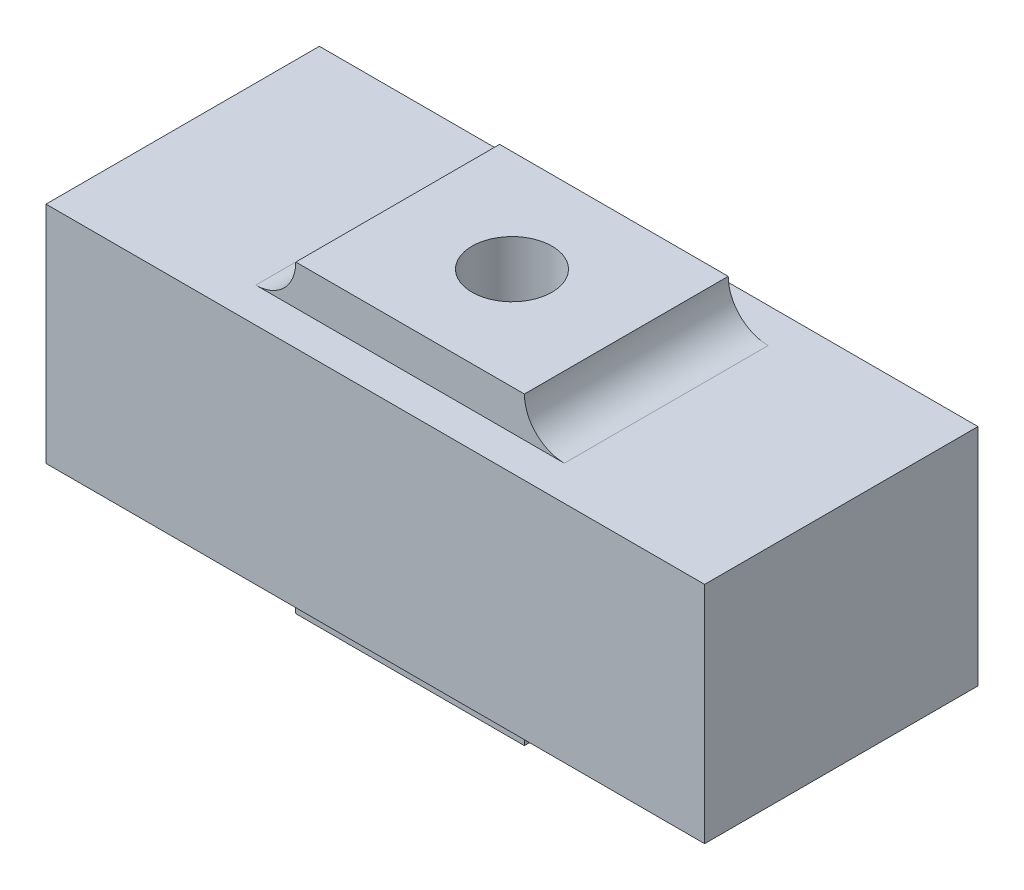
ISO-10303-21;
HEADER;
FILE_DESCRIPTION(('STEP AP214'),'2;1');
FILE_NAME('part.step','',(''),(''),'','','');
FILE_SCHEMA(('AUTOMOTIVE_DESIGN { 1 0 10303 214 1 1 1 1 }'));
ENDSEC;
DATA;
#1=APPLICATION_CONTEXT('core data for automotive mechanical design processes');
#2=APPLICATION_PROTOCOL_DEFINITION('international standard','automotive_design',2000,#1);
#3=PRODUCT_CONTEXT('',#1,'mechanical');
#4=PRODUCT('Part','Part','',(#3));
#5=PRODUCT_RELATED_PRODUCT_CATEGORY('part','',(#4));
#6=PRODUCT_DEFINITION_FORMATION('','',#4);
#7=PRODUCT_DEFINITION_CONTEXT('part definition',#1,'design');
#8=PRODUCT_DEFINITION('design','',#6,#7);
#9=PRODUCT_DEFINITION_SHAPE('','',#8);
#10=(LENGTH_UNIT() NAMED_UNIT(*) SI_UNIT(.MILLI.,.METRE.));
#11=(NAMED_UNIT(*) PLANE_ANGLE_UNIT() SI_UNIT($,.RADIAN.));
#12=(NAMED_UNIT(*) SI_UNIT($,.STERADIAN.) SOLID_ANGLE_UNIT());
#13=UNCERTAINTY_MEASURE_WITH_UNIT(LENGTH_MEASURE(1.E-05),#10,'distance_accuracy_value','');
#14=(GEOMETRIC_REPRESENTATION_CONTEXT(3) GLOBAL_UNCERTAINTY_ASSIGNED_CONTEXT((#13)) GLOBAL_UNIT_ASSIGNED_CONTEXT((#10,
#11,#12)) REPRESENTATION_CONTEXT('',''));
#15=CARTESIAN_POINT('',(0.,0.,0.));
#16=DIRECTION('',(0.,0.,1.));
#17=DIRECTION('',(1.,0.,0.));
#18=AXIS2_PLACEMENT_3D('',#15,#16,#17);
#19=CARTESIAN_POINT('',(20.6,14.05,8.55));
#20=DIRECTION('',(-1.,0.,0.));
#21=DIRECTION('',(0.,0.,1.));
#22=AXIS2_PLACEMENT_3D('',#19,#20,#21);
#23=PLANE('',#22);
#24=DIRECTION('',(0.,0.,-1.));
#25=VECTOR('',#24,1.);
#26=CARTESIAN_POINT('',(20.6,0.,8.55));
#27=LINE('',#26,#25);
#28=CARTESIAN_POINT('',(20.6,0.,8.55));
#29=VERTEX_POINT('',#28);
#30=CARTESIAN_POINT('',(20.6,0.,-8.55));
#31=VERTEX_POINT('',#30);
#32=EDGE_CURVE('E162',#29,#31,#27,.T.);
#33=ORIENTED_EDGE('',*,*,#32,.T.);
#34=DIRECTION('',(0.,-1.,0.));
#35=VECTOR('',#34,1.);
#36=CARTESIAN_POINT('',(20.6,14.05,-8.55));
#37=LINE('',#36,#35);
#38=CARTESIAN_POINT('',(20.6,14.05,-8.55));
#39=VERTEX_POINT('',#38);
#40=EDGE_CURVE('E189',#39,#31,#37,.T.);
#41=ORIENTED_EDGE('',*,*,#40,.F.);
#42=DIRECTION('',(0.,0.,-1.));
#43=VECTOR('',#42,1.);
#44=CARTESIAN_POINT('',(20.6,14.05,8.55));
#45=LINE('',#44,#43);
#46=CARTESIAN_POINT('',(20.6,14.05,8.55));
#47=VERTEX_POINT('',#46);
#48=EDGE_CURVE('E163',#47,#39,#45,.T.);
#49=ORIENTED_EDGE('',*,*,#48,.F.);
#50=DIRECTION('',(0.,-1.,0.));
#51=VECTOR('',#50,1.);
#52=CARTESIAN_POINT('',(20.6,14.05,8.55));
#53=LINE('',#52,#51);
#54=EDGE_CURVE('E173',#47,#29,#53,.T.);
#55=ORIENTED_EDGE('',*,*,#54,.T.);
#56=EDGE_LOOP('',(#33,#41,#49,#55));
#57=FACE_BOUND('',#56,.T.);
#58=ADVANCED_FACE('F34',(#57),#23,.F.);
#59=CARTESIAN_POINT('',(-20.6,14.05,-8.55));
#60=DIRECTION('',(0.,0.,1.));
#61=DIRECTION('',(1.,0.,0.));
#62=AXIS2_PLACEMENT_3D('',#59,#60,#61);
#63=PLANE('',#62);
#64=DIRECTION('',(-1.,0.,0.));
#65=VECTOR('',#64,1.);
#66=CARTESIAN_POINT('',(-20.6,0.,-8.55));
#67=LINE('',#66,#65);
#68=CARTESIAN_POINT('',(-20.6,0.,-8.55));
#69=VERTEX_POINT('',#68);
#70=EDGE_CURVE('E176',#31,#69,#67,.T.);
#71=ORIENTED_EDGE('',*,*,#70,.T.);
#72=DIRECTION('',(0.,-1.,0.));
#73=VECTOR('',#72,1.);
#74=CARTESIAN_POINT('',(-20.6,14.05,-8.55));
#75=LINE('',#74,#73);
#76=CARTESIAN_POINT('',(-20.6,14.05,-8.55));
#77=VERTEX_POINT('',#76);
#78=EDGE_CURVE('E186',#77,#69,#75,.T.);
#79=ORIENTED_EDGE('',*,*,#78,.F.);
#80=DIRECTION('',(-1.,0.,0.));
#81=VECTOR('',#80,1.);
#82=CARTESIAN_POINT('',(-20.6,14.05,-8.55));
#83=LINE('',#82,#81);
#84=EDGE_CURVE('E166',#39,#77,#83,.T.);
#85=ORIENTED_EDGE('',*,*,#84,.F.);
#86=ORIENTED_EDGE('',*,*,#40,.T.);
#87=EDGE_LOOP('',(#71,#79,#85,#86));
#88=FACE_BOUND('',#87,.T.);
#89=ADVANCED_FACE('F254',(#88),#63,.F.);
#90=CARTESIAN_POINT('',(-20.6,14.05,8.55));
#91=DIRECTION('',(1.,0.,0.));
#92=DIRECTION('',(0.,0.,-1.));
#93=AXIS2_PLACEMENT_3D('',#90,#91,#92);
#94=PLANE('',#93);
#95=DIRECTION('',(0.,0.,1.));
#96=VECTOR('',#95,1.);
#97=CARTESIAN_POINT('',(-20.6,0.,8.55));
#98=LINE('',#97,#96);
#99=CARTESIAN_POINT('',(-20.6,0.,8.55));
#100=VERTEX_POINT('',#99);
#101=EDGE_CURVE('E178',#69,#100,#98,.T.);
#102=ORIENTED_EDGE('',*,*,#101,.T.);
#103=DIRECTION('',(0.,-1.,0.));
#104=VECTOR('',#103,1.);
#105=CARTESIAN_POINT('',(-20.6,14.05,8.55));
#106=LINE('',#105,#104);
#107=CARTESIAN_POINT('',(-20.6,14.05,8.55));
#108=VERTEX_POINT('',#107);
#109=EDGE_CURVE('E183',#108,#100,#106,.T.);
#110=ORIENTED_EDGE('',*,*,#109,.F.);
#111=DIRECTION('',(0.,0.,1.));
#112=VECTOR('',#111,1.);
#113=CARTESIAN_POINT('',(-20.6,14.05,8.55));
#114=LINE('',#113,#112);
#115=EDGE_CURVE('E169',#77,#108,#114,.T.);
#116=ORIENTED_EDGE('',*,*,#115,.F.);
#117=ORIENTED_EDGE('',*,*,#78,.T.);
#118=EDGE_LOOP('',(#102,#110,#116,#117));
#119=FACE_BOUND('',#118,.T.);
#120=ADVANCED_FACE('F260',(#119),#94,.F.);
#121=CARTESIAN_POINT('',(-20.6,14.05,8.55));
#122=DIRECTION('',(0.,0.,-1.));
#123=DIRECTION('',(-1.,0.,0.));
#124=AXIS2_PLACEMENT_3D('',#121,#122,#123);
#125=PLANE('',#124);
#126=DIRECTION('',(1.,0.,0.));
#127=VECTOR('',#126,1.);
#128=CARTESIAN_POINT('',(-20.6,0.,8.55));
#129=LINE('',#128,#127);
#130=EDGE_CURVE('E167',#100,#29,#129,.T.);
#131=ORIENTED_EDGE('',*,*,#130,.T.);
#132=ORIENTED_EDGE('',*,*,#54,.F.);
#133=DIRECTION('',(1.,0.,0.));
#134=VECTOR('',#133,1.);
#135=CARTESIAN_POINT('',(-20.6,14.05,8.55));
#136=LINE('',#135,#134);
#137=EDGE_CURVE('E171',#108,#47,#136,.T.);
#138=ORIENTED_EDGE('',*,*,#137,.F.);
#139=ORIENTED_EDGE('',*,*,#109,.T.);
#140=EDGE_LOOP('',(#131,#132,#138,#139));
#141=FACE_BOUND('',#140,.T.);
#142=ADVANCED_FACE('F286',(#141),#125,.F.);
#143=CARTESIAN_POINT('',(0.,14.05,0.));
#144=DIRECTION('',(0.,-1.,0.));
#145=DIRECTION('',(0.,0.,-1.));
#146=AXIS2_PLACEMENT_3D('',#143,#144,#145);
#147=PLANE('',#146);
#148=DIRECTION('',(0.,0.,-1.));
#149=VECTOR('',#148,1.);
#150=CARTESIAN_POINT('',(-9.65,14.05,0.));
#151=LINE('',#150,#149);
#152=CARTESIAN_POINT('',(-9.65,14.05,6.375));
#153=VERTEX_POINT('',#152);
#154=CARTESIAN_POINT('',(-9.65,14.05,-6.375));
#155=VERTEX_POINT('',#154);
#156=EDGE_CURVE('E202',#153,#155,#151,.T.);
#157=ORIENTED_EDGE('',*,*,#156,.T.);
#158=DIRECTION('',(1.,0.,0.));
#159=VECTOR('',#158,1.);
#160=CARTESIAN_POINT('',(0.,14.05,-6.375));
#161=LINE('',#160,#159);
#162=CARTESIAN_POINT('',(9.65,14.05,-6.375));
#163=VERTEX_POINT('',#162);
#164=EDGE_CURVE('E48',#155,#163,#161,.T.);
#165=ORIENTED_EDGE('',*,*,#164,.T.);
#166=DIRECTION('',(0.,0.,1.));
#167=VECTOR('',#166,1.);
#168=CARTESIAN_POINT('',(9.65,14.05,0.));
#169=LINE('',#168,#167);
#170=CARTESIAN_POINT('',(9.65,14.05,6.375));
#171=VERTEX_POINT('',#170);
#172=EDGE_CURVE('E200',#163,#171,#169,.T.);
#173=ORIENTED_EDGE('',*,*,#172,.T.);
#174=DIRECTION('',(-1.,0.,0.));
#175=VECTOR('',#174,1.);
#176=CARTESIAN_POINT('',(0.,14.05,6.375));
#177=LINE('',#176,#175);
#178=EDGE_CURVE('E56',#171,#153,#177,.T.);
#179=ORIENTED_EDGE('',*,*,#178,.T.);
#180=EDGE_LOOP('',(#157,#165,#173,#179));
#181=FACE_BOUND('',#180,.T.);
#182=ORIENTED_EDGE('',*,*,#48,.T.);
#183=ORIENTED_EDGE('',*,*,#84,.T.);
#184=ORIENTED_EDGE('',*,*,#115,.T.);
#185=ORIENTED_EDGE('',*,*,#137,.T.);
#186=EDGE_LOOP('',(#182,#183,#184,#185));
#187=FACE_BOUND('',#186,.T.);
#188=ADVANCED_FACE('F273',(#181,#187),#147,.F.);
#189=CARTESIAN_POINT('',(0.,0.,0.));
#190=DIRECTION('',(0.,-1.,0.));
#191=DIRECTION('',(0.,0.,-1.));
#192=AXIS2_PLACEMENT_3D('',#189,#190,#191);
#193=PLANE('',#192);
#194=DIRECTION('',(-1.,0.,0.));
#195=VECTOR('',#194,1.);
#196=CARTESIAN_POINT('',(0.,0.,6.375));
#197=LINE('',#196,#195);
#198=CARTESIAN_POINT('',(9.65,0.,6.375));
#199=VERTEX_POINT('',#198);
#200=CARTESIAN_POINT('',(-9.65,0.,6.375));
#201=VERTEX_POINT('',#200);
#202=EDGE_CURVE('E192',#199,#201,#197,.T.);
#203=ORIENTED_EDGE('',*,*,#202,.F.);
#204=DIRECTION('',(0.,0.,1.));
#205=VECTOR('',#204,1.);
#206=CARTESIAN_POINT('',(9.65,0.,-6.375));
#207=LINE('',#206,#205);
#208=CARTESIAN_POINT('',(9.65,0.,-6.375));
#209=VERTEX_POINT('',#208);
#210=EDGE_CURVE('E197',#199,#209,#207,.F.);
#211=ORIENTED_EDGE('',*,*,#210,.T.);
#212=DIRECTION('',(1.,0.,0.));
#213=VECTOR('',#212,1.);
#214=CARTESIAN_POINT('',(0.,0.,-6.375));
#215=LINE('',#214,#213);
#216=CARTESIAN_POINT('',(-9.65,0.,-6.375));
#217=VERTEX_POINT('',#216);
#218=EDGE_CURVE('E194',#217,#209,#215,.T.);
#219=ORIENTED_EDGE('',*,*,#218,.F.);
#220=DIRECTION('',(0.,0.,-1.));
#221=VECTOR('',#220,1.);
#222=CARTESIAN_POINT('',(-9.65,0.,6.375));
#223=LINE('',#222,#221);
#224=EDGE_CURVE('E130',#217,#201,#223,.F.);
#225=ORIENTED_EDGE('',*,*,#224,.T.);
#226=EDGE_LOOP('',(#203,#211,#219,#225));
#227=FACE_BOUND('',#226,.T.);
#228=ORIENTED_EDGE('',*,*,#32,.F.);
#229=ORIENTED_EDGE('',*,*,#130,.F.);
#230=ORIENTED_EDGE('',*,*,#101,.F.);
#231=ORIENTED_EDGE('',*,*,#70,.F.);
#232=EDGE_LOOP('',(#228,#229,#230,#231));
#233=FACE_BOUND('',#232,.T.);
#234=ADVANCED_FACE('F283',(#227,#233),#193,.T.);
#235=CARTESIAN_POINT('',(0.,-2.5,0.));
#236=DIRECTION('',(0.,-1.,0.));
#237=DIRECTION('',(0.,0.,-1.));
#238=AXIS2_PLACEMENT_3D('',#235,#236,#237);
#239=PLANE('',#238);
#240=CARTESIAN_POINT('',(0.,-2.5,0.));
#241=DIRECTION('',(0.,1.,0.));
#242=DIRECTION('',(0.,0.,1.));
#243=AXIS2_PLACEMENT_3D('',#240,#241,#242);
#244=CIRCLE('',#243,2.5);
#245=CARTESIAN_POINT('',(0.,-2.5,2.5));
#246=VERTEX_POINT('',#245);
#247=EDGE_CURVE('E227',#246,#246,#244,.T.);
#248=ORIENTED_EDGE('',*,*,#247,.T.);
#249=EDGE_LOOP('',(#248));
#250=FACE_BOUND('',#249,.T.);
#251=DIRECTION('',(0.,0.,-1.));
#252=VECTOR('',#251,1.);
#253=CARTESIAN_POINT('',(7.15,-2.5,6.375));
#254=LINE('',#253,#252);
#255=CARTESIAN_POINT('',(7.15,-2.5,6.375));
#256=VERTEX_POINT('',#255);
#257=CARTESIAN_POINT('',(7.15,-2.5,-6.375));
#258=VERTEX_POINT('',#257);
#259=EDGE_CURVE('E157',#256,#258,#254,.T.);
#260=ORIENTED_EDGE('',*,*,#259,.F.);
#261=DIRECTION('',(1.,0.,0.));
#262=VECTOR('',#261,1.);
#263=CARTESIAN_POINT('',(-7.15,-2.5,6.375));
#264=LINE('',#263,#262);
#265=CARTESIAN_POINT('',(-7.15,-2.5,6.375));
#266=VERTEX_POINT('',#265);
#267=EDGE_CURVE('E144',#266,#256,#264,.T.);
#268=ORIENTED_EDGE('',*,*,#267,.F.);
#269=DIRECTION('',(0.,0.,1.));
#270=VECTOR('',#269,1.);
#271=CARTESIAN_POINT('',(-7.15,-2.5,6.375));
#272=LINE('',#271,#270);
#273=CARTESIAN_POINT('',(-7.15,-2.5,-6.375));
#274=VERTEX_POINT('',#273);
#275=EDGE_CURVE('E128',#274,#266,#272,.T.);
#276=ORIENTED_EDGE('',*,*,#275,.F.);
#277=DIRECTION('',(-1.,0.,0.));
#278=VECTOR('',#277,1.);
#279=CARTESIAN_POINT('',(-7.15,-2.5,-6.375));
#280=LINE('',#279,#278);
#281=EDGE_CURVE('E141',#258,#274,#280,.T.);
#282=ORIENTED_EDGE('',*,*,#281,.F.);
#283=EDGE_LOOP('',(#260,#268,#276,#282));
#284=FACE_BOUND('',#283,.T.);
#285=ADVANCED_FACE('F140',(#250,#284),#239,.T.);
#286=CARTESIAN_POINT('',(-7.15,-24.158614250514,6.375));
#287=DIRECTION('',(0.,0.,1.));
#288=DIRECTION('',(1.,0.,0.));
#289=AXIS2_PLACEMENT_3D('',#286,#287,#288);
#290=PLANE('',#289);
#291=ORIENTED_EDGE('',*,*,#267,.T.);
#292=CARTESIAN_POINT('',(9.65,-2.5,6.375));
#293=DIRECTION('',(0.,0.,1.));
#294=DIRECTION('',(1.,0.,0.));
#295=AXIS2_PLACEMENT_3D('',#292,#293,#294);
#296=CIRCLE('',#295,2.5);
#297=EDGE_CURVE('E204',#256,#199,#296,.F.);
#298=ORIENTED_EDGE('',*,*,#297,.T.);
#299=ORIENTED_EDGE('',*,*,#202,.T.);
#300=CARTESIAN_POINT('',(-9.65,-2.5,6.375));
#301=DIRECTION('',(0.,0.,1.));
#302=DIRECTION('',(1.,0.,0.));
#303=AXIS2_PLACEMENT_3D('',#300,#301,#302);
#304=CIRCLE('',#303,2.5);
#305=EDGE_CURVE('E133',#201,#266,#304,.F.);
#306=ORIENTED_EDGE('',*,*,#305,.T.);
#307=EDGE_LOOP('',(#291,#298,#299,#306));
#308=FACE_BOUND('',#307,.T.);
#309=ADVANCED_FACE('F251',(#308),#290,.T.);
#310=CARTESIAN_POINT('',(-7.15,-24.158614250514,-6.375));
#311=DIRECTION('',(0.,0.,-1.));
#312=DIRECTION('',(-1.,0.,0.));
#313=AXIS2_PLACEMENT_3D('',#310,#311,#312);
#314=PLANE('',#313);
#315=ORIENTED_EDGE('',*,*,#281,.T.);
#316=CARTESIAN_POINT('',(-9.65,-2.5,-6.375));
#317=DIRECTION('',(0.,0.,-1.));
#318=DIRECTION('',(-1.,0.,0.));
#319=AXIS2_PLACEMENT_3D('',#316,#317,#318);
#320=CIRCLE('',#319,2.5);
#321=EDGE_CURVE('E124',#274,#217,#320,.F.);
#322=ORIENTED_EDGE('',*,*,#321,.T.);
#323=ORIENTED_EDGE('',*,*,#218,.T.);
#324=CARTESIAN_POINT('',(9.65,-2.5,-6.375));
#325=DIRECTION('',(0.,0.,-1.));
#326=DIRECTION('',(-1.,0.,0.));
#327=AXIS2_PLACEMENT_3D('',#324,#325,#326);
#328=CIRCLE('',#327,2.5);
#329=EDGE_CURVE('E134',#209,#258,#328,.F.);
#330=ORIENTED_EDGE('',*,*,#329,.T.);
#331=EDGE_LOOP('',(#315,#322,#323,#330));
#332=FACE_BOUND('',#331,.T.);
#333=ADVANCED_FACE('F146',(#332),#314,.T.);
#334=ORIENTED_EDGE('',*,*,#164,.F.);
#335=CARTESIAN_POINT('',(-9.65,16.55,-6.375));
#336=DIRECTION('',(0.,0.,-1.));
#337=DIRECTION('',(-1.,0.,0.));
#338=AXIS2_PLACEMENT_3D('',#335,#336,#337);
#339=CIRCLE('',#338,2.5);
#340=CARTESIAN_POINT('',(-7.15,16.55,-6.375));
#341=VERTEX_POINT('',#340);
#342=EDGE_CURVE('E209',#155,#341,#339,.F.);
#343=ORIENTED_EDGE('',*,*,#342,.T.);
#344=DIRECTION('',(-1.,0.,0.));
#345=VECTOR('',#344,1.);
#346=CARTESIAN_POINT('',(-7.15,16.55,-6.375));
#347=LINE('',#346,#345);
#348=CARTESIAN_POINT('',(7.15,16.55,-6.375));
#349=VERTEX_POINT('',#348);
#350=EDGE_CURVE('E226',#349,#341,#347,.T.);
#351=ORIENTED_EDGE('',*,*,#350,.F.);
#352=CARTESIAN_POINT('',(9.65,16.55,-6.375));
#353=DIRECTION('',(0.,0.,-1.));
#354=DIRECTION('',(-1.,0.,0.));
#355=AXIS2_PLACEMENT_3D('',#352,#353,#354);
#356=CIRCLE('',#355,2.5);
#357=EDGE_CURVE('E12',#349,#163,#356,.F.);
#358=ORIENTED_EDGE('',*,*,#357,.T.);
#359=EDGE_LOOP('',(#334,#343,#351,#358));
#360=FACE_BOUND('',#359,.T.);
#361=ADVANCED_FACE('F249',(#360),#314,.T.);
#362=ORIENTED_EDGE('',*,*,#178,.F.);
#363=CARTESIAN_POINT('',(9.65,16.55,6.375));
#364=DIRECTION('',(0.,0.,1.));
#365=DIRECTION('',(1.,0.,0.));
#366=AXIS2_PLACEMENT_3D('',#363,#364,#365);
#367=CIRCLE('',#366,2.5);
#368=CARTESIAN_POINT('',(7.15,16.55,6.375));
#369=VERTEX_POINT('',#368);
#370=EDGE_CURVE('E42',#171,#369,#367,.F.);
#371=ORIENTED_EDGE('',*,*,#370,.T.);
#372=DIRECTION('',(1.,0.,0.));
#373=VECTOR('',#372,1.);
#374=CARTESIAN_POINT('',(-7.15,16.55,6.375));
#375=LINE('',#374,#373);
#376=CARTESIAN_POINT('',(-7.15,16.55,6.375));
#377=VERTEX_POINT('',#376);
#378=EDGE_CURVE('E148',#377,#369,#375,.T.);
#379=ORIENTED_EDGE('',*,*,#378,.F.);
#380=CARTESIAN_POINT('',(-9.65,16.55,6.375));
#381=DIRECTION('',(0.,0.,1.));
#382=DIRECTION('',(1.,0.,0.));
#383=AXIS2_PLACEMENT_3D('',#380,#381,#382);
#384=CIRCLE('',#383,2.5);
#385=EDGE_CURVE('E211',#377,#153,#384,.F.);
#386=ORIENTED_EDGE('',*,*,#385,.T.);
#387=EDGE_LOOP('',(#362,#371,#379,#386));
#388=FACE_BOUND('',#387,.T.);
#389=ADVANCED_FACE('F215',(#388),#290,.T.);
#390=CARTESIAN_POINT('',(0.,16.55,0.));
#391=DIRECTION('',(0.,-1.,0.));
#392=DIRECTION('',(0.,0.,-1.));
#393=AXIS2_PLACEMENT_3D('',#390,#391,#392);
#394=PLANE('',#393);
#395=CARTESIAN_POINT('',(0.,16.55,0.));
#396=DIRECTION('',(0.,1.,0.));
#397=DIRECTION('',(0.,0.,1.));
#398=AXIS2_PLACEMENT_3D('',#395,#396,#397);
#399=CIRCLE('',#398,2.5);
#400=CARTESIAN_POINT('',(0.,16.55,2.5));
#401=VERTEX_POINT('',#400);
#402=EDGE_CURVE('E229',#401,#401,#399,.T.);
#403=ORIENTED_EDGE('',*,*,#402,.F.);
#404=EDGE_LOOP('',(#403));
#405=FACE_BOUND('',#404,.T.);
#406=DIRECTION('',(0.,0.,-1.));
#407=VECTOR('',#406,1.);
#408=CARTESIAN_POINT('',(7.15,16.55,6.375));
#409=LINE('',#408,#407);
#410=EDGE_CURVE('E155',#369,#349,#409,.T.);
#411=ORIENTED_EDGE('',*,*,#410,.T.);
#412=ORIENTED_EDGE('',*,*,#350,.T.);
#413=DIRECTION('',(0.,0.,1.));
#414=VECTOR('',#413,1.);
#415=CARTESIAN_POINT('',(-7.15,16.55,6.375));
#416=LINE('',#415,#414);
#417=EDGE_CURVE('E151',#341,#377,#416,.T.);
#418=ORIENTED_EDGE('',*,*,#417,.T.);
#419=ORIENTED_EDGE('',*,*,#378,.T.);
#420=EDGE_LOOP('',(#411,#412,#418,#419));
#421=FACE_BOUND('',#420,.T.);
#422=ADVANCED_FACE('F222',(#405,#421),#394,.F.);
#423=CARTESIAN_POINT('',(9.65,-2.5,6.375));
#424=DIRECTION('',(0.,0.,-1.));
#425=DIRECTION('',(-1.,0.,0.));
#426=AXIS2_PLACEMENT_3D('',#423,#424,#425);
#427=CYLINDRICAL_SURFACE('',#426,2.5);
#428=ORIENTED_EDGE('',*,*,#329,.F.);
#429=ORIENTED_EDGE('',*,*,#210,.F.);
#430=ORIENTED_EDGE('',*,*,#297,.F.);
#431=ORIENTED_EDGE('',*,*,#259,.T.);
#432=EDGE_LOOP('',(#428,#429,#430,#431));
#433=FACE_BOUND('',#432,.T.);
#434=ADVANCED_FACE('F241',(#433),#427,.F.);
#435=CARTESIAN_POINT('',(-9.65,-2.5,6.375));
#436=DIRECTION('',(0.,0.,1.));
#437=DIRECTION('',(1.,0.,0.));
#438=AXIS2_PLACEMENT_3D('',#435,#436,#437);
#439=CYLINDRICAL_SURFACE('',#438,2.5);
#440=ORIENTED_EDGE('',*,*,#305,.F.);
#441=ORIENTED_EDGE('',*,*,#224,.F.);
#442=ORIENTED_EDGE('',*,*,#321,.F.);
#443=ORIENTED_EDGE('',*,*,#275,.T.);
#444=EDGE_LOOP('',(#440,#441,#442,#443));
#445=FACE_BOUND('',#444,.T.);
#446=ADVANCED_FACE('F127',(#445),#439,.F.);
#447=CARTESIAN_POINT('',(-9.65,16.55,0.));
#448=DIRECTION('',(0.,0.,-1.));
#449=DIRECTION('',(-1.,0.,0.));
#450=AXIS2_PLACEMENT_3D('',#447,#448,#449);
#451=CYLINDRICAL_SURFACE('',#450,2.5);
#452=ORIENTED_EDGE('',*,*,#385,.F.);
#453=ORIENTED_EDGE('',*,*,#417,.F.);
#454=ORIENTED_EDGE('',*,*,#342,.F.);
#455=ORIENTED_EDGE('',*,*,#156,.F.);
#456=EDGE_LOOP('',(#452,#453,#454,#455));
#457=FACE_BOUND('',#456,.T.);
#458=ADVANCED_FACE('F266',(#457),#451,.F.);
#459=CARTESIAN_POINT('',(9.65,16.55,0.));
#460=DIRECTION('',(0.,0.,1.));
#461=DIRECTION('',(1.,0.,0.));
#462=AXIS2_PLACEMENT_3D('',#459,#460,#461);
#463=CYLINDRICAL_SURFACE('',#462,2.5);
#464=ORIENTED_EDGE('',*,*,#357,.F.);
#465=ORIENTED_EDGE('',*,*,#410,.F.);
#466=ORIENTED_EDGE('',*,*,#370,.F.);
#467=ORIENTED_EDGE('',*,*,#172,.F.);
#468=EDGE_LOOP('',(#464,#465,#466,#467));
#469=FACE_BOUND('',#468,.T.);
#470=ADVANCED_FACE('F36',(#469),#463,.F.);
#471=CARTESIAN_POINT('',(0.,-2.5,0.));
#472=DIRECTION('',(0.,1.,0.));
#473=DIRECTION('',(0.,0.,1.));
#474=AXIS2_PLACEMENT_3D('',#471,#472,#473);
#475=CYLINDRICAL_SURFACE('',#474,2.5);
#476=ORIENTED_EDGE('',*,*,#247,.F.);
#477=EDGE_LOOP('',(#476));
#478=FACE_BOUND('',#477,.T.);
#479=ORIENTED_EDGE('',*,*,#402,.T.);
#480=EDGE_LOOP('',(#479));
#481=FACE_BOUND('',#480,.T.);
#482=ADVANCED_FACE('F238',(#478,#481),#475,.F.);
#483=CLOSED_SHELL('',(#58,#89,#120,#142,#188,#234,#285,#309,#333,#361,#389,#422,#434,#446,#458,
#470,#482));
#484=MANIFOLD_SOLID_BREP('B2',#483);
#485=ADVANCED_BREP_SHAPE_REPRESENTATION('',(#18,#484),#14);
#486=SHAPE_DEFINITION_REPRESENTATION(#9,#485);
ENDSEC;
END-ISO-10303-21;
